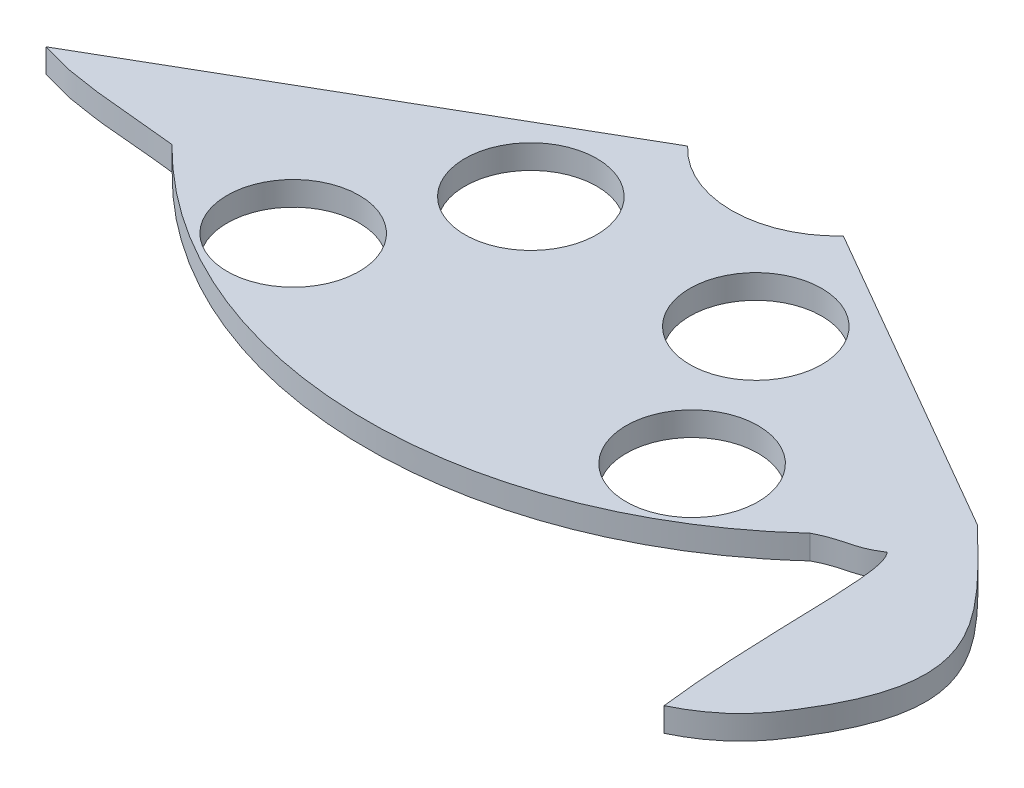
ISO-10303-21;
HEADER;
FILE_DESCRIPTION(('STEP AP214'),'2;1');
FILE_NAME('part.step','',(''),(''),'','','');
FILE_SCHEMA(('AUTOMOTIVE_DESIGN { 1 0 10303 214 1 1 1 1 }'));
ENDSEC;
DATA;
#1=APPLICATION_CONTEXT('core data for automotive mechanical design processes');
#2=APPLICATION_PROTOCOL_DEFINITION('international standard','automotive_design',2000,#1);
#3=PRODUCT_CONTEXT('',#1,'mechanical');
#4=PRODUCT('Part','Part','',(#3));
#5=PRODUCT_RELATED_PRODUCT_CATEGORY('part','',(#4));
#6=PRODUCT_DEFINITION_FORMATION('','',#4);
#7=PRODUCT_DEFINITION_CONTEXT('part definition',#1,'design');
#8=PRODUCT_DEFINITION('design','',#6,#7);
#9=PRODUCT_DEFINITION_SHAPE('','',#8);
#10=(LENGTH_UNIT() NAMED_UNIT(*) SI_UNIT(.MILLI.,.METRE.));
#11=(NAMED_UNIT(*) PLANE_ANGLE_UNIT() SI_UNIT($,.RADIAN.));
#12=(NAMED_UNIT(*) SI_UNIT($,.STERADIAN.) SOLID_ANGLE_UNIT());
#13=UNCERTAINTY_MEASURE_WITH_UNIT(LENGTH_MEASURE(1.E-05),#10,'distance_accuracy_value','');
#14=(GEOMETRIC_REPRESENTATION_CONTEXT(3) GLOBAL_UNCERTAINTY_ASSIGNED_CONTEXT((#13)) GLOBAL_UNIT_ASSIGNED_CONTEXT((#10,
#11,#12)) REPRESENTATION_CONTEXT('',''));
#15=CARTESIAN_POINT('',(0.,0.,0.));
#16=DIRECTION('',(0.,0.,1.));
#17=DIRECTION('',(1.,0.,0.));
#18=AXIS2_PLACEMENT_3D('',#15,#16,#17);
#19=CARTESIAN_POINT('',(-68.5612286542199,-27.7359999999999,53.6734064837464));
#20=DIRECTION('',(0.,-1.,0.));
#21=DIRECTION('',(0.,0.,-1.));
#22=AXIS2_PLACEMENT_3D('',#19,#20,#21);
#23=PLANE('',#22);
#24=CARTESIAN_POINT('',(18.75,-27.7359999999999,32.476));
#25=DIRECTION('',(0.,-1.,0.));
#26=DIRECTION('',(0.,0.,-1.));
#27=AXIS2_PLACEMENT_3D('',#24,#25,#26);
#28=CIRCLE('',#27,10.999845998306);
#29=CARTESIAN_POINT('',(18.75,-27.7359999999999,21.476154001694));
#30=VERTEX_POINT('',#29);
#31=EDGE_CURVE('E320',#30,#30,#28,.T.);
#32=ORIENTED_EDGE('',*,*,#31,.F.);
#33=EDGE_LOOP('',(#32));
#34=FACE_BOUND('',#33,.T.);
#35=CARTESIAN_POINT('',(-33.25,-27.7359999999999,57.591));
#36=DIRECTION('',(0.,-1.,0.));
#37=DIRECTION('',(0.,0.,-1.));
#38=AXIS2_PLACEMENT_3D('',#35,#36,#37);
#39=CIRCLE('',#38,10.999845998306);
#40=CARTESIAN_POINT('',(-33.25,-27.7359999999999,46.591154001694));
#41=VERTEX_POINT('',#40);
#42=EDGE_CURVE('E313',#41,#41,#39,.T.);
#43=ORIENTED_EDGE('',*,*,#42,.F.);
#44=EDGE_LOOP('',(#43));
#45=FACE_BOUND('',#44,.T.);
#46=DIRECTION('',(0.866026689555144,0.,-0.499997772973199));
#47=VECTOR('',#46,1.);
#48=CARTESIAN_POINT('',(-69.4473397155558,-27.7359999999999,44.714296535633));
#49=LINE('',#48,#47);
#50=CARTESIAN_POINT('',(-80.7831862167474,-27.7359999999999,51.2590116970945));
#51=VERTEX_POINT('',#50);
#52=CARTESIAN_POINT('',(-69.4473397155558,-27.7359999999999,44.714296535633));
#53=VERTEX_POINT('',#52);
#54=EDGE_CURVE('E309',#51,#53,#49,.T.);
#55=ORIENTED_EDGE('',*,*,#54,.T.);
#56=DIRECTION('',(0.866025121509883,0.,-0.500000488913553));
#57=VECTOR('',#56,1.);
#58=CARTESIAN_POINT('',(-69.4473397155558,-27.7359999999999,44.714296535633));
#59=LINE('',#58,#57);
#60=CARTESIAN_POINT('',(-12.9766531358799,-27.7359999999999,12.1108879302399));
#61=VERTEX_POINT('',#60);
#62=EDGE_CURVE('E100',#53,#61,#59,.T.);
#63=ORIENTED_EDGE('',*,*,#62,.T.);
#64=CARTESIAN_POINT('',(0.,-27.7359999999999,0.));
#65=DIRECTION('',(0.,1.,0.));
#66=DIRECTION('',(0.,0.,-1.));
#67=AXIS2_PLACEMENT_3D('',#64,#65,#66);
#68=CIRCLE('',#67,17.7501305084715);
#69=CARTESIAN_POINT('',(12.9766531358511,-27.7359999999999,12.1108879302707));
#70=VERTEX_POINT('',#69);
#71=EDGE_CURVE('E306',#61,#70,#68,.T.);
#72=ORIENTED_EDGE('',*,*,#71,.T.);
#73=DIRECTION('',(0.866025113442762,0.,0.500000502886197));
#74=VECTOR('',#73,1.);
#75=CARTESIAN_POINT('',(12.9766531358511,-27.7359999999999,12.1108879302707));
#76=LINE('',#75,#74);
#77=CARTESIAN_POINT('',(65.8946490574716,-27.7359999999999,42.6631480920527));
#78=VERTEX_POINT('',#77);
#79=EDGE_CURVE('E300',#70,#78,#76,.T.);
#80=ORIENTED_EDGE('',*,*,#79,.T.);
#81=CARTESIAN_POINT('',(65.8946490574716,-27.7359999999999,42.6631480920527));
#82=CARTESIAN_POINT('',(81.2383570122726,-27.7359999999999,57.6152141275644));
#83=CARTESIAN_POINT('',(89.9374263412387,-27.7359999999999,65.8113401457254));
#84=CARTESIAN_POINT('',(73.7337723522561,-27.7359999999999,89.9010128395377));
#85=CARTESIAN_POINT('',(70.1752181282031,-27.7359999999999,92.7664869464439));
#86=CARTESIAN_POINT('',(65.8440984830518,-27.7359999999999,94.8522972837208));
#87=B_SPLINE_CURVE_WITH_KNOTS('',3,(#81,#82,#83,#84,#85,#86),.UNSPECIFIED.,.F.,.F.,(4,2,4),(0.,
0.837160428876228,1.),.UNSPECIFIED.);
#88=CARTESIAN_POINT('',(65.8441089277339,-27.7359999999999,94.8522922536968));
#89=VERTEX_POINT('',#88);
#90=EDGE_CURVE('E275',#78,#89,#87,.T.);
#91=ORIENTED_EDGE('',*,*,#90,.T.);
#92=CARTESIAN_POINT('',(62.2755087547801,-27.7359999999999,54.1122355939023));
#93=CARTESIAN_POINT('',(62.3266192430533,-27.7359999999999,54.1699732663106));
#94=CARTESIAN_POINT('',(62.4318143310961,-27.7359999999999,54.2888036366157));
#95=CARTESIAN_POINT('',(62.5724896791839,-27.7359999999999,54.4903283306719));
#96=CARTESIAN_POINT('',(62.7063805668704,-27.7359999999999,54.714128411608));
#97=CARTESIAN_POINT('',(62.8859638163512,-27.7359999999999,55.0685448727052));
#98=CARTESIAN_POINT('',(63.091631452287,-27.7359999999999,55.5915489816227));
#99=CARTESIAN_POINT('',(63.3429327912433,-27.7359999999999,56.4532673372439));
#100=CARTESIAN_POINT('',(63.5785892816123,-27.7359999999999,57.6203475271628));
#101=CARTESIAN_POINT('',(63.7666257012106,-27.7359999999999,58.9899941319844));
#102=CARTESIAN_POINT('',(63.9099365252909,-27.7359999999999,60.4321592671485));
#103=CARTESIAN_POINT('',(64.0494092760135,-27.7359999999999,62.3047583443745));
#104=CARTESIAN_POINT('',(64.1670443203941,-27.7359999999999,64.6753421553893));
#105=CARTESIAN_POINT('',(64.2664191701575,-27.7359999999999,67.4902085799562));
#106=CARTESIAN_POINT('',(64.3487981388482,-27.7359999999999,70.3056992855746));
#107=CARTESIAN_POINT('',(64.4154669468905,-27.7359999999999,72.6520061123916));
#108=CARTESIAN_POINT('',(64.4725617516335,-27.7359999999999,74.5289348020474));
#109=CARTESIAN_POINT('',(64.5335120439495,-27.7359999999999,76.4055798566303));
#110=CARTESIAN_POINT('',(64.6193385087515,-27.7359999999999,78.7507340971859));
#111=CARTESIAN_POINT('',(64.744681422549,-27.7359999999999,81.5635760692582));
#112=CARTESIAN_POINT('',(64.8988491772077,-27.7359999999999,84.374488875223));
#113=CARTESIAN_POINT('',(65.0571517714022,-27.7359999999999,86.719320955091));
#114=CARTESIAN_POINT('',(65.2046396024728,-27.7359999999999,88.5900627981417));
#115=CARTESIAN_POINT('',(65.3217480606023,-27.7359999999999,89.9406461547562));
#116=CARTESIAN_POINT('',(65.4434061411613,-27.7359999999999,91.2279666152676));
#117=CARTESIAN_POINT('',(65.5689149422204,-27.7359999999999,92.4543151066945));
#118=CARTESIAN_POINT('',(65.7011166189491,-27.7359999999999,93.6604679677826));
#119=CARTESIAN_POINT('',(65.7967041598795,-27.7359999999999,94.4571790194458));
#120=CARTESIAN_POINT('',(65.8441089277339,-27.7359999999999,94.8522922536968));
#121=B_SPLINE_CURVE_WITH_KNOTS('',3,(#92,#93,#94,#95,#96,#97,#98,#99,#100,#101,#102,#103,#104,
#105,#106,#107,#108,#109,#110,#111,#112,#113,#114,#115,#116,#117,#118,#119,#120),.UNSPECIFIED.,
.F.,.F.,(4,1,1,1,1,1,1,1,1,1,1,1,1,1,1,1,1,1,1,1,1,1,1,1,1,1,4),(0.,0.005624179748285,
0.0115753611252289,0.0179035407033377,0.0246486044963791,0.0405530712357571,0.0588327547039063,
0.090105924568066,0.127349804255726,0.159702949336848,0.195872267731154,0.264396037182652,
0.332923459385077,0.401452431411221,0.469981458396479,0.504245945192835,0.538509757191767,
0.607026989779701,0.675528345738199,0.744015536301525,0.812495212378262,0.847057398883729,
0.880980500159926,0.911440992680279,0.941434583815239,0.970956628811091,1.00000198258113),.UNSPECIFIED.);
#122=CARTESIAN_POINT('',(62.2755087547809,-27.7359999999999,54.1122355939031));
#123=VERTEX_POINT('',#122);
#124=EDGE_CURVE('E124',#89,#123,#121,.F.);
#125=ORIENTED_EDGE('',*,*,#124,.T.);
#126=CARTESIAN_POINT('',(53.1303911460647,-27.7359999999999,57.7880670822766));
#127=CARTESIAN_POINT('',(53.2175511360422,-27.7359999999999,57.7425732431927));
#128=CARTESIAN_POINT('',(53.3802419413835,-27.7359999999999,57.6576555037513));
#129=CARTESIAN_POINT('',(53.7313534764893,-27.7359999999999,57.4814526272987));
#130=CARTESIAN_POINT('',(54.3754030095421,-27.7359999999999,57.17678713229));
#131=CARTESIAN_POINT('',(55.3453574641,-27.7359999999999,56.7818647359935));
#132=CARTESIAN_POINT('',(56.3445266998864,-27.7359999999999,56.4665023516139));
#133=CARTESIAN_POINT('',(57.1542348944323,-27.7359999999999,56.2459375570913));
#134=CARTESIAN_POINT('',(57.9673984698596,-27.7359999999999,56.0333188869035));
#135=CARTESIAN_POINT('',(58.9808521627782,-27.7359999999999,55.7539073584484));
#136=CARTESIAN_POINT('',(60.1631902995906,-27.7359999999999,55.3155825721633));
#137=CARTESIAN_POINT('',(61.10190433462,-27.7359999999999,54.8453456793138));
#138=CARTESIAN_POINT('',(61.7145277152935,-27.7359999999999,54.4792748342456));
#139=CARTESIAN_POINT('',(62.0442812080695,-27.7359999999999,54.2678803883244));
#140=CARTESIAN_POINT('',(62.1955897374735,-27.7359999999999,54.1660319618706));
#141=CARTESIAN_POINT('',(62.2755087547998,-27.7359999999999,54.1122355939311));
#142=B_SPLINE_CURVE_WITH_KNOTS('',3,(#126,#127,#128,#129,#130,#131,#132,#133,#134,#135,#136,
#137,#138,#139,#140,#141),.UNSPECIFIED.,.F.,.F.,(4,1,1,1,1,1,1,1,1,1,1,1,1,4),
(3.13887367888732E-05,0.0298210337786223,0.0556360456893082,0.119056708604838,0.245666039974793,
0.372585778940183,0.436254340542962,0.499940026632528,0.627267780931677,0.754633424607713,
0.881327250136131,0.944737214077149,0.970810734794514,1.),.UNSPECIFIED.);
#143=CARTESIAN_POINT('',(53.1303911460647,-27.7359999999999,57.7880670822766));
#144=VERTEX_POINT('',#143);
#145=EDGE_CURVE('E116',#123,#144,#142,.F.);
#146=ORIENTED_EDGE('',*,*,#145,.T.);
#147=CARTESIAN_POINT('',(-56.1394269279716,-27.7359999999999,54.8686797639619));
#148=CARTESIAN_POINT('',(-52.6175262939561,-27.7359999999999,58.4719983855394));
#149=CARTESIAN_POINT('',(-48.7495089803754,-27.7359999999999,61.734414001229));
#150=CARTESIAN_POINT('',(-40.4573380755175,-27.7359999999999,67.459771709233));
#151=CARTESIAN_POINT('',(-36.0368957741686,-27.7359999999999,69.9211550084487));
#152=CARTESIAN_POINT('',(-26.8006681495254,-27.7359999999999,73.9547771532518));
#153=CARTESIAN_POINT('',(-21.9911364494542,-27.7359999999999,75.5248933212206));
#154=CARTESIAN_POINT('',(-12.1554449538981,-27.7359999999999,77.7161119983587));
#155=CARTESIAN_POINT('',(-7.13313413181398,-27.7359999999999,78.3366809738792));
#156=CARTESIAN_POINT('',(2.94030854550655,-27.7359999999999,78.6059226656511));
#157=CARTESIAN_POINT('',(7.98798639155581,-27.7359999999999,78.2545169171155));
#158=CARTESIAN_POINT('',(17.927233656144,-27.7359999999999,76.591215401033));
#159=CARTESIAN_POINT('',(22.8153250828588,-27.7359999999999,75.2801017515853));
#160=CARTESIAN_POINT('',(29.8924842178698,-27.7359999999999,72.6301504100697));
#161=CARTESIAN_POINT('',(32.2081330428238,-27.7359999999999,71.6335743394989));
#162=CARTESIAN_POINT('',(36.7329814206638,-27.7359999999999,69.4205726698404));
#163=CARTESIAN_POINT('',(38.9447771615099,-27.7359999999999,68.2039453667551));
#164=CARTESIAN_POINT('',(43.2377987573878,-27.7359999999999,65.5678639786725));
#165=CARTESIAN_POINT('',(45.31845866695,-27.7359999999999,64.1465934111431));
#166=CARTESIAN_POINT('',(49.338895948512,-27.7359999999999,61.1075407378893));
#167=CARTESIAN_POINT('',(51.2760119182162,-27.7359999999999,59.4925286132339));
#168=CARTESIAN_POINT('',(53.1303911459953,-27.7359999999999,57.7880670822043));
#169=B_SPLINE_CURVE_WITH_KNOTS('',3,(#147,#148,#149,#150,#151,#152,#153,#154,#155,#156,#157,
#158,#159,#160,#161,#162,#163,#164,#165,#166,#167,#168),.UNSPECIFIED.,.F.,.F.,(4,2,2,2,2,2,2,2,
2,2,4),(1.59766757579227E-06,0.125001597667576,0.250001597667576,0.375001597667576,
0.500001597667576,0.625001597667576,0.750001597667576,0.812501597667576,0.875001597667576,
0.937501597667576,1.),.UNSPECIFIED.);
#170=CARTESIAN_POINT('',(-56.1394215171995,-27.7359999999999,54.8686852998177));
#171=VERTEX_POINT('',#170);
#172=EDGE_CURVE('E121',#144,#171,#169,.F.);
#173=ORIENTED_EDGE('',*,*,#172,.T.);
#174=CARTESIAN_POINT('',(-80.7831862167474,-27.7359999999999,51.2590116970945));
#175=CARTESIAN_POINT('',(-80.5676202729123,-27.7359999999999,51.3193692995179));
#176=CARTESIAN_POINT('',(-80.1131419645365,-27.7359999999999,51.4466214088214));
#177=CARTESIAN_POINT('',(-79.1883092136066,-27.7359999999999,51.6953137724993));
#178=CARTESIAN_POINT('',(-78.2436289560257,-27.7359999999999,51.947894472291));
#179=CARTESIAN_POINT('',(-77.3644277209338,-27.7359999999999,52.191213935083));
#180=CARTESIAN_POINT('',(-76.7776019953257,-27.7359999999999,52.3534336079758));
#181=CARTESIAN_POINT('',(-76.2492315571204,-27.7359999999999,52.4942351618834));
#182=CARTESIAN_POINT('',(-75.7176048680058,-27.7359999999999,52.6195954339904));
#183=CARTESIAN_POINT('',(-75.0029615831157,-27.7359999999999,52.755862283146));
#184=CARTESIAN_POINT('',(-74.2835815760933,-27.7359999999999,52.8629408815057));
#185=CARTESIAN_POINT('',(-73.5643017073792,-27.7359999999999,52.9701379164602));
#186=CARTESIAN_POINT('',(-72.845147040621,-27.7359999999999,53.0786227854565));
#187=CARTESIAN_POINT('',(-71.9467724990994,-27.7359999999999,53.2180176106988));
#188=CARTESIAN_POINT('',(-70.8676379980781,-27.7359999999999,53.3792247683198));
#189=CARTESIAN_POINT('',(-69.7865832893868,-27.7359999999999,53.5308869494648));
#190=CARTESIAN_POINT('',(-68.3395492062531,-27.7359999999999,53.7046945564114));
#191=CARTESIAN_POINT('',(-66.5235908548103,-27.7359999999999,53.8740644441505));
#192=CARTESIAN_POINT('',(-64.3416341099557,-27.7359999999999,54.0574969512495));
#193=CARTESIAN_POINT('',(-62.4457109360316,-27.7359999999999,54.2222532209369));
#194=CARTESIAN_POINT('',(-60.9914863976133,-27.7359999999999,54.3553678793915));
#195=CARTESIAN_POINT('',(-59.8036278568244,-27.7359999999999,54.4689563046801));
#196=CARTESIAN_POINT('',(-58.630996557288,-27.7359999999999,54.5877045239225));
#197=CARTESIAN_POINT('',(-57.3511470987932,-27.7359999999999,54.7257174312714));
#198=CARTESIAN_POINT('',(-56.5327078798453,-27.7359999999999,54.8222826263966));
#199=CARTESIAN_POINT('',(-56.1394215245136,-27.7359999999999,54.8686853069665));
#200=B_SPLINE_CURVE_WITH_KNOTS('',3,(#174,#175,#176,#177,#178,#179,#180,#181,#182,#183,#184,
#185,#186,#187,#188,#189,#190,#191,#192,#193,#194,#195,#196,#197,#198,#199),.UNSPECIFIED.,.F.,
.F.,(4,1,1,1,1,1,1,1,1,1,1,1,1,1,1,1,1,1,1,1,1,1,1,4),(0.,0.0269062306652873,0.0567264846198827,
0.115108058466812,0.14443986855033,0.166373697757315,0.188287091937588,0.210160764247867,
0.232008012844454,0.275709179270462,0.297564638949053,0.319419024805695,0.363125199659079,
0.406836751230029,0.450564235718374,0.494330135704901,0.581999843175868,0.669758238840782,
0.757520448460264,0.810736995599169,0.845279072649915,0.900945917782353,0.952401329171181,1.),.UNSPECIFIED.);
#201=EDGE_CURVE('E51',#171,#51,#200,.F.);
#202=ORIENTED_EDGE('',*,*,#201,.T.);
#203=EDGE_LOOP('',(#55,#63,#72,#80,#91,#125,#146,#173,#202));
#204=FACE_BOUND('',#203,.T.);
#205=CARTESIAN_POINT('',(33.25,-27.7359999999999,57.591));
#206=DIRECTION('',(0.,-1.,0.));
#207=DIRECTION('',(0.,0.,-1.));
#208=AXIS2_PLACEMENT_3D('',#205,#206,#207);
#209=CIRCLE('',#208,10.999845998306);
#210=CARTESIAN_POINT('',(33.25,-27.7359999999999,46.591154001694));
#211=VERTEX_POINT('',#210);
#212=EDGE_CURVE('E314',#211,#211,#209,.T.);
#213=ORIENTED_EDGE('',*,*,#212,.F.);
#214=EDGE_LOOP('',(#213));
#215=FACE_BOUND('',#214,.T.);
#216=CARTESIAN_POINT('',(-18.75,-27.7359999999999,32.476));
#217=DIRECTION('',(0.,-1.,0.));
#218=DIRECTION('',(0.,0.,-1.));
#219=AXIS2_PLACEMENT_3D('',#216,#217,#218);
#220=CIRCLE('',#219,10.999845998306);
#221=CARTESIAN_POINT('',(-18.75,-27.7359999999999,21.476154001694));
#222=VERTEX_POINT('',#221);
#223=EDGE_CURVE('E326',#222,#222,#220,.T.);
#224=ORIENTED_EDGE('',*,*,#223,.F.);
#225=EDGE_LOOP('',(#224));
#226=FACE_BOUND('',#225,.T.);
#227=ADVANCED_FACE('F30',(#34,#45,#204,#215,#226),#23,.T.);
#228=CARTESIAN_POINT('',(-68.5612286542199,-23.7359999999999,53.6734064837464));
#229=DIRECTION('',(0.,-1.,0.));
#230=DIRECTION('',(0.,0.,-1.));
#231=AXIS2_PLACEMENT_3D('',#228,#229,#230);
#232=PLANE('',#231);
#233=CARTESIAN_POINT('',(18.75,-23.7359999999999,32.476));
#234=DIRECTION('',(0.,-1.,0.));
#235=DIRECTION('',(0.,0.,-1.));
#236=AXIS2_PLACEMENT_3D('',#233,#234,#235);
#237=CIRCLE('',#236,10.999845998306);
#238=CARTESIAN_POINT('',(18.75,-23.7359999999999,21.476154001694));
#239=VERTEX_POINT('',#238);
#240=EDGE_CURVE('E323',#239,#239,#237,.T.);
#241=ORIENTED_EDGE('',*,*,#240,.T.);
#242=EDGE_LOOP('',(#241));
#243=FACE_BOUND('',#242,.T.);
#244=CARTESIAN_POINT('',(-33.25,-23.7359999999999,57.591));
#245=DIRECTION('',(0.,-1.,0.));
#246=DIRECTION('',(0.,0.,-1.));
#247=AXIS2_PLACEMENT_3D('',#244,#245,#246);
#248=CIRCLE('',#247,10.999845998306);
#249=CARTESIAN_POINT('',(-33.25,-23.7359999999999,46.591154001694));
#250=VERTEX_POINT('',#249);
#251=EDGE_CURVE('E310',#250,#250,#248,.T.);
#252=ORIENTED_EDGE('',*,*,#251,.T.);
#253=EDGE_LOOP('',(#252));
#254=FACE_BOUND('',#253,.T.);
#255=DIRECTION('',(0.866026689555144,0.,-0.499997772973199));
#256=VECTOR('',#255,1.);
#257=CARTESIAN_POINT('',(-69.4473397155558,-23.7359999999999,44.714296535633));
#258=LINE('',#257,#256);
#259=CARTESIAN_POINT('',(-80.7831862167474,-23.7359999999999,51.2590116970945));
#260=VERTEX_POINT('',#259);
#261=CARTESIAN_POINT('',(-69.4473397155558,-23.7359999999999,44.714296535633));
#262=VERTEX_POINT('',#261);
#263=EDGE_CURVE('E189',#260,#262,#258,.T.);
#264=ORIENTED_EDGE('',*,*,#263,.F.);
#265=CARTESIAN_POINT('',(-56.1394215245136,-23.7359999999999,54.8686853069665));
#266=CARTESIAN_POINT('',(-56.5327078798453,-23.7359999999999,54.8222826263966));
#267=CARTESIAN_POINT('',(-57.3511470987932,-23.7359999999999,54.7257174312714));
#268=CARTESIAN_POINT('',(-58.630996557288,-23.7359999999999,54.5877045239225));
#269=CARTESIAN_POINT('',(-59.8036278568244,-23.7359999999999,54.4689563046801));
#270=CARTESIAN_POINT('',(-60.9914863976133,-23.7359999999999,54.3553678793915));
#271=CARTESIAN_POINT('',(-62.4457109360316,-23.7359999999999,54.2222532209369));
#272=CARTESIAN_POINT('',(-64.3416341099557,-23.7359999999999,54.0574969512495));
#273=CARTESIAN_POINT('',(-66.5235908548103,-23.7359999999999,53.8740644441505));
#274=CARTESIAN_POINT('',(-68.3395492062531,-23.7359999999999,53.7046945564114));
#275=CARTESIAN_POINT('',(-69.7865832893868,-23.7359999999999,53.5308869494648));
#276=CARTESIAN_POINT('',(-70.8676379980781,-23.7359999999999,53.3792247683198));
#277=CARTESIAN_POINT('',(-71.9467724990994,-23.7359999999999,53.2180176106988));
#278=CARTESIAN_POINT('',(-72.845147040621,-23.7359999999999,53.0786227854565));
#279=CARTESIAN_POINT('',(-73.5643017073792,-23.7359999999999,52.9701379164602));
#280=CARTESIAN_POINT('',(-74.2835815760933,-23.7359999999999,52.8629408815057));
#281=CARTESIAN_POINT('',(-75.0029615831157,-23.7359999999999,52.755862283146));
#282=CARTESIAN_POINT('',(-75.7176048680058,-23.7359999999999,52.6195954339904));
#283=CARTESIAN_POINT('',(-76.2492315571204,-23.7359999999999,52.4942351618834));
#284=CARTESIAN_POINT('',(-76.7776019953257,-23.7359999999999,52.3534336079758));
#285=CARTESIAN_POINT('',(-77.3644277209338,-23.7359999999999,52.191213935083));
#286=CARTESIAN_POINT('',(-78.2436289560257,-23.7359999999999,51.947894472291));
#287=CARTESIAN_POINT('',(-79.1883092136066,-23.7359999999999,51.6953137724993));
#288=CARTESIAN_POINT('',(-80.1131419645365,-23.7359999999999,51.4466214088214));
#289=CARTESIAN_POINT('',(-80.5676202729123,-23.7359999999999,51.3193692995179));
#290=CARTESIAN_POINT('',(-80.7831862167474,-23.7359999999999,51.2590116970945));
#291=B_SPLINE_CURVE_WITH_KNOTS('',3,(#265,#266,#267,#268,#269,#270,#271,#272,#273,#274,#275,
#276,#277,#278,#279,#280,#281,#282,#283,#284,#285,#286,#287,#288,#289,#290),.UNSPECIFIED.,.F.,
.F.,(4,1,1,1,1,1,1,1,1,1,1,1,1,1,1,1,1,1,1,1,1,1,1,4),(0.,0.0475986708288189,0.0990540822176467,
0.154720927350085,0.189263004400831,0.242479551539736,0.330241761159218,0.418000156824132,
0.505669864295099,0.549435764281626,0.593163248769971,0.636874800340921,0.680580975194305,
0.702435361050947,0.724290820729538,0.767991987155546,0.789839235752133,0.811712908062412,
0.833626302242685,0.85556013144967,0.884891941533188,0.943273515380117,0.973093769334713,1.),.UNSPECIFIED.);
#292=CARTESIAN_POINT('',(-56.1394215171995,-23.7359999999999,54.8686852998177));
#293=VERTEX_POINT('',#292);
#294=EDGE_CURVE('E91',#293,#260,#291,.T.);
#295=ORIENTED_EDGE('',*,*,#294,.F.);
#296=CARTESIAN_POINT('',(53.1303911459953,-23.7359999999999,57.7880670822043));
#297=CARTESIAN_POINT('',(51.2760119182162,-23.7359999999999,59.4925286132339));
#298=CARTESIAN_POINT('',(49.338895948512,-23.7359999999999,61.1075407378893));
#299=CARTESIAN_POINT('',(45.31845866695,-23.7359999999999,64.1465934111431));
#300=CARTESIAN_POINT('',(43.2377987573878,-23.7359999999999,65.5678639786725));
#301=CARTESIAN_POINT('',(38.9447771615099,-23.7359999999999,68.2039453667551));
#302=CARTESIAN_POINT('',(36.7329814206638,-23.7359999999999,69.4205726698404));
#303=CARTESIAN_POINT('',(32.2081330428238,-23.7359999999999,71.6335743394989));
#304=CARTESIAN_POINT('',(29.8924842178698,-23.7359999999999,72.6301504100697));
#305=CARTESIAN_POINT('',(22.8153250828588,-23.7359999999999,75.2801017515853));
#306=CARTESIAN_POINT('',(17.927233656144,-23.7359999999999,76.591215401033));
#307=CARTESIAN_POINT('',(7.98798639155581,-23.7359999999999,78.2545169171155));
#308=CARTESIAN_POINT('',(2.94030854550655,-23.7359999999999,78.6059226656511));
#309=CARTESIAN_POINT('',(-7.13313413181398,-23.7359999999999,78.3366809738792));
#310=CARTESIAN_POINT('',(-12.1554449538981,-23.7359999999999,77.7161119983587));
#311=CARTESIAN_POINT('',(-21.9911364494542,-23.7359999999999,75.5248933212206));
#312=CARTESIAN_POINT('',(-26.8006681495254,-23.7359999999999,73.9547771532518));
#313=CARTESIAN_POINT('',(-36.0368957741686,-23.7359999999999,69.9211550084487));
#314=CARTESIAN_POINT('',(-40.4573380755175,-23.7359999999999,67.459771709233));
#315=CARTESIAN_POINT('',(-48.7495089803754,-23.7359999999999,61.734414001229));
#316=CARTESIAN_POINT('',(-52.6175262939561,-23.7359999999999,58.4719983855394));
#317=CARTESIAN_POINT('',(-56.1394269279716,-23.7359999999999,54.8686797639619));
#318=B_SPLINE_CURVE_WITH_KNOTS('',3,(#296,#297,#298,#299,#300,#301,#302,#303,#304,#305,#306,
#307,#308,#309,#310,#311,#312,#313,#314,#315,#316,#317),.UNSPECIFIED.,.F.,.F.,(4,2,2,2,2,2,2,2,
2,2,4),(1.59766757579144E-06,0.0624999999999999,0.125,0.1875,0.25,0.375,0.5,0.625,0.75,0.875,
1.),.UNSPECIFIED.);
#319=CARTESIAN_POINT('',(53.1303911460647,-23.7359999999999,57.7880670822766));
#320=VERTEX_POINT('',#319);
#321=EDGE_CURVE('E84',#320,#293,#318,.T.);
#322=ORIENTED_EDGE('',*,*,#321,.F.);
#323=CARTESIAN_POINT('',(62.2755087547998,-23.7359999999999,54.1122355939311));
#324=CARTESIAN_POINT('',(62.1955897374735,-23.7359999999999,54.1660319618706));
#325=CARTESIAN_POINT('',(62.0442812080695,-23.7359999999999,54.2678803883244));
#326=CARTESIAN_POINT('',(61.7145277152935,-23.7359999999999,54.4792748342456));
#327=CARTESIAN_POINT('',(61.10190433462,-23.7359999999999,54.8453456793138));
#328=CARTESIAN_POINT('',(60.1631902995906,-23.7359999999999,55.3155825721633));
#329=CARTESIAN_POINT('',(58.9808521627782,-23.7359999999999,55.7539073584484));
#330=CARTESIAN_POINT('',(57.9673984698596,-23.7359999999999,56.0333188869035));
#331=CARTESIAN_POINT('',(57.1542348944323,-23.7359999999999,56.2459375570913));
#332=CARTESIAN_POINT('',(56.3445266998864,-23.7359999999999,56.4665023516139));
#333=CARTESIAN_POINT('',(55.3453574641,-23.7359999999999,56.7818647359935));
#334=CARTESIAN_POINT('',(54.3754030095421,-23.7359999999999,57.17678713229));
#335=CARTESIAN_POINT('',(53.7313534764893,-23.7359999999999,57.4814526272987));
#336=CARTESIAN_POINT('',(53.3802419413835,-23.7359999999999,57.6576555037513));
#337=CARTESIAN_POINT('',(53.2175511360422,-23.7359999999999,57.7425732431927));
#338=CARTESIAN_POINT('',(53.1303911460647,-23.7359999999999,57.7880670822766));
#339=B_SPLINE_CURVE_WITH_KNOTS('',3,(#323,#324,#325,#326,#327,#328,#329,#330,#331,#332,#333,
#334,#335,#336,#337,#338),.UNSPECIFIED.,.F.,.F.,(4,1,1,1,1,1,1,1,1,1,1,1,1,4),
(3.13887367888217E-05,0.0292206539422754,0.0552941746596395,0.118704138600658,0.245397964129075,
0.372763607805111,0.500091362104261,0.563777048193827,0.627445609796606,0.754365348761996,
0.880974680131951,0.944395343047481,0.970210354958167,1.),.UNSPECIFIED.);
#340=CARTESIAN_POINT('',(62.2755087547809,-23.7359999999999,54.1122355939031));
#341=VERTEX_POINT('',#340);
#342=EDGE_CURVE('E135',#341,#320,#339,.T.);
#343=ORIENTED_EDGE('',*,*,#342,.F.);
#344=CARTESIAN_POINT('',(65.8441089277339,-23.7359999999999,94.8522922536968));
#345=CARTESIAN_POINT('',(65.7967041598795,-23.7359999999999,94.4571790194458));
#346=CARTESIAN_POINT('',(65.7011166189491,-23.7359999999999,93.6604679677826));
#347=CARTESIAN_POINT('',(65.5689149422204,-23.7359999999999,92.4543151066945));
#348=CARTESIAN_POINT('',(65.4434061411613,-23.7359999999999,91.2279666152676));
#349=CARTESIAN_POINT('',(65.3217480606023,-23.7359999999999,89.9406461547562));
#350=CARTESIAN_POINT('',(65.2046396024728,-23.7359999999999,88.5900627981417));
#351=CARTESIAN_POINT('',(65.0571517714022,-23.7359999999999,86.719320955091));
#352=CARTESIAN_POINT('',(64.8988491772077,-23.7359999999999,84.374488875223));
#353=CARTESIAN_POINT('',(64.744681422549,-23.7359999999999,81.5635760692582));
#354=CARTESIAN_POINT('',(64.6193385087515,-23.7359999999999,78.7507340971859));
#355=CARTESIAN_POINT('',(64.5335120439495,-23.7359999999999,76.4055798566303));
#356=CARTESIAN_POINT('',(64.4725617516335,-23.7359999999999,74.5289348020474));
#357=CARTESIAN_POINT('',(64.4154669468905,-23.7359999999999,72.6520061123916));
#358=CARTESIAN_POINT('',(64.3487981388482,-23.7359999999999,70.3056992855746));
#359=CARTESIAN_POINT('',(64.2664191701575,-23.7359999999999,67.4902085799562));
#360=CARTESIAN_POINT('',(64.1670443203941,-23.7359999999999,64.6753421553893));
#361=CARTESIAN_POINT('',(64.0494092760135,-23.7359999999999,62.3047583443745));
#362=CARTESIAN_POINT('',(63.9099365252909,-23.7359999999999,60.4321592671485));
#363=CARTESIAN_POINT('',(63.7666257012106,-23.7359999999999,58.9899941319844));
#364=CARTESIAN_POINT('',(63.5785892816123,-23.7359999999999,57.6203475271628));
#365=CARTESIAN_POINT('',(63.3429327912433,-23.7359999999999,56.4532673372439));
#366=CARTESIAN_POINT('',(63.091631452287,-23.7359999999999,55.5915489816227));
#367=CARTESIAN_POINT('',(62.8859638163512,-23.7359999999999,55.0685448727052));
#368=CARTESIAN_POINT('',(62.7063805668704,-23.7359999999999,54.714128411608));
#369=CARTESIAN_POINT('',(62.5724896791839,-23.7359999999999,54.4903283306719));
#370=CARTESIAN_POINT('',(62.4318143310961,-23.7359999999999,54.2888036366157));
#371=CARTESIAN_POINT('',(62.3266192430533,-23.7359999999999,54.1699732663106));
#372=CARTESIAN_POINT('',(62.2755087547801,-23.7359999999999,54.1122355939023));
#373=B_SPLINE_CURVE_WITH_KNOTS('',3,(#344,#345,#346,#347,#348,#349,#350,#351,#352,#353,#354,
#355,#356,#357,#358,#359,#360,#361,#362,#363,#364,#365,#366,#367,#368,#369,#370,#371,#372),
.UNSPECIFIED.,.F.,.F.,(4,1,1,1,1,1,1,1,1,1,1,1,1,1,1,1,1,1,1,1,1,1,1,1,1,1,4),(0.,
0.0290453537700364,0.0585673987658884,0.0885609899008483,0.119021482421202,0.152944583697398,
0.187506770202865,0.255986446279603,0.324473636842928,0.392974992801427,0.46149222538936,
0.495756037388292,0.530020524184648,0.598549551169907,0.66707852319605,0.735605945398475,
0.804129714849973,0.840299033244279,0.872652178325401,0.909896058013061,0.941169227877221,
0.95944891134537,0.975353378084748,0.98209844187779,0.988426621455898,0.994377802832842,
1.00000198258113),.UNSPECIFIED.);
#374=CARTESIAN_POINT('',(65.8441089277339,-23.7359999999999,94.8522922536968));
#375=VERTEX_POINT('',#374);
#376=EDGE_CURVE('E519',#375,#341,#373,.T.);
#377=ORIENTED_EDGE('',*,*,#376,.F.);
#378=CARTESIAN_POINT('',(65.8946490574716,-23.7359999999999,42.6631480920527));
#379=CARTESIAN_POINT('',(81.2383570122726,-23.7359999999999,57.6152141275644));
#380=CARTESIAN_POINT('',(89.9374263412387,-23.7359999999999,65.8113401457254));
#381=CARTESIAN_POINT('',(73.7337723522561,-23.7359999999999,89.9010128395377));
#382=CARTESIAN_POINT('',(70.1752181282031,-23.7359999999999,92.7664869464439));
#383=CARTESIAN_POINT('',(65.8440984830518,-23.7359999999999,94.8522972837208));
#384=B_SPLINE_CURVE_WITH_KNOTS('',3,(#378,#379,#380,#381,#382,#383),.UNSPECIFIED.,.F.,.F.,(4,2,
4),(0.,0.837160428876228,1.),.UNSPECIFIED.);
#385=CARTESIAN_POINT('',(65.8946490574716,-23.7359999999999,42.6631480920527));
#386=VERTEX_POINT('',#385);
#387=EDGE_CURVE('E193',#386,#375,#384,.T.);
#388=ORIENTED_EDGE('',*,*,#387,.F.);
#389=DIRECTION('',(0.866025113442762,0.,0.500000502886197));
#390=VECTOR('',#389,1.);
#391=CARTESIAN_POINT('',(12.9766531358511,-23.7359999999999,12.1108879302707));
#392=LINE('',#391,#390);
#393=CARTESIAN_POINT('',(12.9766531358511,-23.7359999999999,12.1108879302707));
#394=VERTEX_POINT('',#393);
#395=EDGE_CURVE('E191',#394,#386,#392,.T.);
#396=ORIENTED_EDGE('',*,*,#395,.F.);
#397=CARTESIAN_POINT('',(0.,-23.7359999999999,0.));
#398=DIRECTION('',(0.,1.,0.));
#399=DIRECTION('',(0.,0.,-1.));
#400=AXIS2_PLACEMENT_3D('',#397,#398,#399);
#401=CIRCLE('',#400,17.7501305084715);
#402=CARTESIAN_POINT('',(-12.9766531358799,-23.7359999999999,12.1108879302399));
#403=VERTEX_POINT('',#402);
#404=EDGE_CURVE('E188',#403,#394,#401,.T.);
#405=ORIENTED_EDGE('',*,*,#404,.F.);
#406=DIRECTION('',(0.866025121509883,0.,-0.500000488913553));
#407=VECTOR('',#406,1.);
#408=CARTESIAN_POINT('',(-69.4473397155558,-23.7359999999999,44.714296535633));
#409=LINE('',#408,#407);
#410=EDGE_CURVE('E183',#262,#403,#409,.T.);
#411=ORIENTED_EDGE('',*,*,#410,.F.);
#412=EDGE_LOOP('',(#264,#295,#322,#343,#377,#388,#396,#405,#411));
#413=FACE_BOUND('',#412,.T.);
#414=CARTESIAN_POINT('',(33.25,-23.7359999999999,57.591));
#415=DIRECTION('',(0.,-1.,0.));
#416=DIRECTION('',(0.,0.,-1.));
#417=AXIS2_PLACEMENT_3D('',#414,#415,#416);
#418=CIRCLE('',#417,10.999845998306);
#419=CARTESIAN_POINT('',(33.25,-23.7359999999999,46.591154001694));
#420=VERTEX_POINT('',#419);
#421=EDGE_CURVE('E317',#420,#420,#418,.T.);
#422=ORIENTED_EDGE('',*,*,#421,.T.);
#423=EDGE_LOOP('',(#422));
#424=FACE_BOUND('',#423,.T.);
#425=CARTESIAN_POINT('',(-18.75,-23.7359999999999,32.476));
#426=DIRECTION('',(0.,-1.,0.));
#427=DIRECTION('',(0.,0.,-1.));
#428=AXIS2_PLACEMENT_3D('',#425,#426,#427);
#429=CIRCLE('',#428,10.999845998306);
#430=CARTESIAN_POINT('',(-18.75,-23.7359999999999,21.476154001694));
#431=VERTEX_POINT('',#430);
#432=EDGE_CURVE('E329',#431,#431,#429,.T.);
#433=ORIENTED_EDGE('',*,*,#432,.T.);
#434=EDGE_LOOP('',(#433));
#435=FACE_BOUND('',#434,.T.);
#436=ADVANCED_FACE('F215',(#243,#254,#413,#424,#435),#232,.F.);
#437=CARTESIAN_POINT('',(-69.4473397155558,-27.7359999999999,44.714296535633));
#438=DIRECTION('',(0.499997772973199,0.,0.866026689555144));
#439=DIRECTION('',(0.866026689555144,0.,-0.499997772973199));
#440=AXIS2_PLACEMENT_3D('',#437,#438,#439);
#441=PLANE('',#440);
#442=ORIENTED_EDGE('',*,*,#263,.T.);
#443=DIRECTION('',(0.,1.,0.));
#444=VECTOR('',#443,1.);
#445=CARTESIAN_POINT('',(-69.4473397155558,-27.7359999999999,44.714296535633));
#446=LINE('',#445,#444);
#447=EDGE_CURVE('E11',#53,#262,#446,.T.);
#448=ORIENTED_EDGE('',*,*,#447,.F.);
#449=ORIENTED_EDGE('',*,*,#54,.F.);
#450=DIRECTION('',(0.,1.,0.));
#451=VECTOR('',#450,1.);
#452=CARTESIAN_POINT('',(-80.7831862167474,-27.7359999999999,51.2590116970945));
#453=LINE('',#452,#451);
#454=EDGE_CURVE('E482',#51,#260,#453,.T.);
#455=ORIENTED_EDGE('',*,*,#454,.T.);
#456=EDGE_LOOP('',(#442,#448,#449,#455));
#457=FACE_BOUND('',#456,.T.);
#458=ADVANCED_FACE('F32',(#457),#441,.F.);
#459=CARTESIAN_POINT('',(-69.4473397155558,-27.7359999999999,44.714296535633));
#460=DIRECTION('',(0.500000488913553,0.,0.866025121509883));
#461=DIRECTION('',(0.866025121509883,0.,-0.500000488913553));
#462=AXIS2_PLACEMENT_3D('',#459,#460,#461);
#463=PLANE('',#462);
#464=ORIENTED_EDGE('',*,*,#410,.T.);
#465=DIRECTION('',(0.,1.,0.));
#466=VECTOR('',#465,1.);
#467=CARTESIAN_POINT('',(-12.9766531358799,-27.7359999999999,12.1108879302399));
#468=LINE('',#467,#466);
#469=EDGE_CURVE('E42',#61,#403,#468,.T.);
#470=ORIENTED_EDGE('',*,*,#469,.F.);
#471=ORIENTED_EDGE('',*,*,#62,.F.);
#472=ORIENTED_EDGE('',*,*,#447,.T.);
#473=EDGE_LOOP('',(#464,#470,#471,#472));
#474=FACE_BOUND('',#473,.T.);
#475=ADVANCED_FACE('F348',(#474),#463,.F.);
#476=CARTESIAN_POINT('',(0.,-27.7359999999999,0.));
#477=DIRECTION('',(0.,1.,0.));
#478=DIRECTION('',(0.,0.,1.));
#479=AXIS2_PLACEMENT_3D('',#476,#477,#478);
#480=CYLINDRICAL_SURFACE('',#479,17.7501305084715);
#481=ORIENTED_EDGE('',*,*,#404,.T.);
#482=DIRECTION('',(0.,1.,0.));
#483=VECTOR('',#482,1.);
#484=CARTESIAN_POINT('',(12.9766531358511,-27.7359999999999,12.1108879302707));
#485=LINE('',#484,#483);
#486=EDGE_CURVE('E197',#70,#394,#485,.T.);
#487=ORIENTED_EDGE('',*,*,#486,.F.);
#488=ORIENTED_EDGE('',*,*,#71,.F.);
#489=ORIENTED_EDGE('',*,*,#469,.T.);
#490=EDGE_LOOP('',(#481,#487,#488,#489));
#491=FACE_BOUND('',#490,.T.);
#492=ADVANCED_FACE('F408',(#491),#480,.F.);
#493=CARTESIAN_POINT('',(12.9766531358511,-27.7359999999999,12.1108879302707));
#494=DIRECTION('',(-0.500000502886198,0.,0.866025113442763));
#495=DIRECTION('',(0.866025113442762,0.,0.500000502886197));
#496=AXIS2_PLACEMENT_3D('',#493,#494,#495);
#497=PLANE('',#496);
#498=ORIENTED_EDGE('',*,*,#395,.T.);
#499=DIRECTION('',(0.,1.,0.));
#500=VECTOR('',#499,1.);
#501=CARTESIAN_POINT('',(65.8946490574716,-27.7359999999999,42.6631480920527));
#502=LINE('',#501,#500);
#503=EDGE_CURVE('E194',#78,#386,#502,.T.);
#504=ORIENTED_EDGE('',*,*,#503,.F.);
#505=ORIENTED_EDGE('',*,*,#79,.F.);
#506=ORIENTED_EDGE('',*,*,#486,.T.);
#507=EDGE_LOOP('',(#498,#504,#505,#506));
#508=FACE_BOUND('',#507,.T.);
#509=ADVANCED_FACE('F400',(#508),#497,.F.);
#510=DIRECTION('',(0.,1.,0.));
#511=VECTOR('',#510,1.);
#512=SURFACE_OF_LINEAR_EXTRUSION('',#87,#511);
#513=ORIENTED_EDGE('',*,*,#387,.T.);
#514=DIRECTION('',(0.,1.,0.));
#515=VECTOR('',#514,1.);
#516=CARTESIAN_POINT('',(65.8441089277339,-27.7359999999999,94.8522922536968));
#517=LINE('',#516,#515);
#518=EDGE_CURVE('E198',#89,#375,#517,.T.);
#519=ORIENTED_EDGE('',*,*,#518,.F.);
#520=ORIENTED_EDGE('',*,*,#90,.F.);
#521=ORIENTED_EDGE('',*,*,#503,.T.);
#522=EDGE_LOOP('',(#513,#519,#520,#521));
#523=FACE_BOUND('',#522,.T.);
#524=ADVANCED_FACE('F287',(#523),#512,.F.);
#525=CARTESIAN_POINT('',(-4877.1841040268,-27.7359999999999,830.022980984099));
#526=CARTESIAN_POINT('',(115.31363587458,-27.7359999999999,197.064256340167));
#527=CARTESIAN_POINT('',(71.5642288141988,-27.7359999999999,147.153053872677));
#528=CARTESIAN_POINT('',(65.5689149422204,-27.7359999999999,92.4543151066945));
#529=CARTESIAN_POINT('',(65.4434061411613,-27.7359999999999,91.2279666152676));
#530=CARTESIAN_POINT('',(65.3217480606023,-27.7359999999999,89.9406461547562));
#531=CARTESIAN_POINT('',(65.2046396024728,-27.7359999999999,88.5900627981417));
#532=CARTESIAN_POINT('',(65.0571517714022,-27.7359999999999,86.719320955091));
#533=CARTESIAN_POINT('',(64.8988491772077,-27.7359999999999,84.374488875223));
#534=CARTESIAN_POINT('',(64.744681422549,-27.7359999999999,81.5635760692582));
#535=CARTESIAN_POINT('',(64.6193385087515,-27.7359999999999,78.7507340971859));
#536=CARTESIAN_POINT('',(64.5335120439495,-27.7359999999999,76.4055798566303));
#537=CARTESIAN_POINT('',(64.4725617516335,-27.7359999999999,74.5289348020474));
#538=CARTESIAN_POINT('',(64.4154669468905,-27.7359999999999,72.6520061123916));
#539=CARTESIAN_POINT('',(64.3487981388482,-27.7359999999999,70.3056992855746));
#540=CARTESIAN_POINT('',(64.2664191701575,-27.7359999999999,67.4902085799562));
#541=CARTESIAN_POINT('',(64.1670443203941,-27.7359999999999,64.6753421553893));
#542=CARTESIAN_POINT('',(64.0494092760135,-27.7359999999999,62.3047583443745));
#543=CARTESIAN_POINT('',(63.9099365252909,-27.7359999999999,60.4321592671485));
#544=CARTESIAN_POINT('',(63.7666257012106,-27.7359999999999,58.9899941319844));
#545=CARTESIAN_POINT('',(63.5785892816123,-27.7359999999999,57.6203475271628));
#546=CARTESIAN_POINT('',(63.3429327912433,-27.7359999999999,56.4532673372439));
#547=CARTESIAN_POINT('',(63.091631452287,-27.7359999999999,55.5915489816227));
#548=CARTESIAN_POINT('',(62.8859638163512,-27.7359999999999,55.0685448727052));
#549=CARTESIAN_POINT('',(62.7063805668704,-27.7359999999999,54.714128411608));
#550=CARTESIAN_POINT('',(62.5724896791839,-27.7359999999999,54.4903283306719));
#551=CARTESIAN_POINT('',(57.7913264623846,-27.7359999999999,47.6410653461072));
#552=CARTESIAN_POINT('',(14.5160533770583,-27.7359999999999,71.8854507566692));
#553=CARTESIAN_POINT('',(3940.91331682822,-27.7359999999999,-3098.79907970768));
#554=B_SPLINE_CURVE_WITH_KNOTS('',3,(#525,#526,#527,#528,#529,#530,#531,#532,#533,#534,#535,
#536,#537,#538,#539,#540,#541,#542,#543,#544,#545,#546,#547,#548,#549,#550,#551,#552,#553),
.UNSPECIFIED.,.F.,.F.,(4,1,1,1,1,1,1,1,1,1,1,1,1,1,1,1,1,1,1,1,1,1,1,1,1,1,4),
(-3.92765835320398,0.0290453537700364,0.0585673987658884,0.0885609899008483,0.119021482421202,
0.152944583697398,0.187506770202865,0.255986446279603,0.324473636842928,0.392974992801427,
0.46149222538936,0.495756037388292,0.530020524184648,0.598549551169907,0.66707852319605,
0.735605945398475,0.804129714849973,0.840299033244279,0.872652178325401,0.909896058013061,
0.941169227877221,0.95944891134537,0.975353378084748,0.98209844187779,0.988426621455898,
0.994377802832842,1.59058991835069),.UNSPECIFIED.);
#555=DIRECTION('',(0.,1.,0.));
#556=VECTOR('',#555,1.);
#557=SURFACE_OF_LINEAR_EXTRUSION('',#554,#556);
#558=ORIENTED_EDGE('',*,*,#376,.T.);
#559=DIRECTION('',(0.,1.,0.));
#560=VECTOR('',#559,1.);
#561=CARTESIAN_POINT('',(62.2755087547809,-27.7359999999999,54.1122355939031));
#562=LINE('',#561,#560);
#563=EDGE_CURVE('E137',#123,#341,#562,.T.);
#564=ORIENTED_EDGE('',*,*,#563,.F.);
#565=ORIENTED_EDGE('',*,*,#124,.F.);
#566=ORIENTED_EDGE('',*,*,#518,.T.);
#567=EDGE_LOOP('',(#558,#564,#565,#566));
#568=FACE_BOUND('',#567,.T.);
#569=ADVANCED_FACE('F278',(#568),#557,.F.);
#570=CARTESIAN_POINT('',(62.2757665780406,-27.7359999999999,54.1120620438217));
#571=CARTESIAN_POINT('',(62.1957616203591,-27.7359999999999,54.1659162628962));
#572=CARTESIAN_POINT('',(62.0443684272972,-27.7359999999999,54.2678244748596));
#573=CARTESIAN_POINT('',(61.7145277152935,-27.7359999999999,54.4792748342456));
#574=CARTESIAN_POINT('',(61.10190433462,-27.7359999999999,54.8453456793138));
#575=CARTESIAN_POINT('',(60.1631902995906,-27.7359999999999,55.3155825721633));
#576=CARTESIAN_POINT('',(58.9808521627782,-27.7359999999999,55.7539073584484));
#577=CARTESIAN_POINT('',(57.9673984698596,-27.7359999999999,56.0333188869035));
#578=CARTESIAN_POINT('',(57.1542348944323,-27.7359999999999,56.2459375570913));
#579=CARTESIAN_POINT('',(56.3445266998864,-27.7359999999999,56.4665023516139));
#580=CARTESIAN_POINT('',(55.3453574641,-27.7359999999999,56.7818647359935));
#581=CARTESIAN_POINT('',(54.3754030095421,-27.7359999999999,57.17678713229));
#582=CARTESIAN_POINT('',(53.7313534764893,-27.7359999999999,57.4814526272987));
#583=CARTESIAN_POINT('',(53.3802419413835,-27.7359999999999,57.6576555037513));
#584=CARTESIAN_POINT('',(53.2175511360422,-27.7359999999999,57.7425732431927));
#585=CARTESIAN_POINT('',(53.1303911460647,-27.7359999999999,57.7880670822766));
#586=B_SPLINE_CURVE_WITH_KNOTS('',3,(#570,#571,#572,#573,#574,#575,#576,#577,#578,#579,#580,
#581,#582,#583,#584,#585),.UNSPECIFIED.,.F.,.F.,(4,1,1,1,1,1,1,1,1,1,1,1,1,4),(0.,
0.0292206539422754,0.0552941746596395,0.118704138600658,0.245397964129075,0.372763607805111,
0.500091362104261,0.563777048193827,0.627445609796606,0.754365348761996,0.880974680131951,
0.944395343047481,0.970210354958167,1.),.UNSPECIFIED.);
#587=DIRECTION('',(0.,1.,0.));
#588=VECTOR('',#587,1.);
#589=SURFACE_OF_LINEAR_EXTRUSION('',#586,#588);
#590=ORIENTED_EDGE('',*,*,#342,.T.);
#591=DIRECTION('',(0.,1.,0.));
#592=VECTOR('',#591,1.);
#593=CARTESIAN_POINT('',(53.1303911460647,-27.7359999999999,57.7880670822766));
#594=LINE('',#593,#592);
#595=EDGE_CURVE('E132',#144,#320,#594,.T.);
#596=ORIENTED_EDGE('',*,*,#595,.F.);
#597=ORIENTED_EDGE('',*,*,#145,.F.);
#598=ORIENTED_EDGE('',*,*,#563,.T.);
#599=EDGE_LOOP('',(#590,#596,#597,#598));
#600=FACE_BOUND('',#599,.T.);
#601=ADVANCED_FACE('F133',(#600),#589,.F.);
#602=CARTESIAN_POINT('',(53.1305333581835,-27.7359999999999,57.7879363668673));
#603=CARTESIAN_POINT('',(51.2761109564562,-27.7359999999999,59.4924460429806));
#604=CARTESIAN_POINT('',(49.3389473357471,-27.7359999999999,61.1075018942255));
#605=CARTESIAN_POINT('',(45.31845866695,-27.7359999999999,64.1465934111431));
#606=CARTESIAN_POINT('',(43.2377987573878,-27.7359999999999,65.5678639786725));
#607=CARTESIAN_POINT('',(38.9447771615099,-27.7359999999999,68.2039453667551));
#608=CARTESIAN_POINT('',(36.7329814206638,-27.7359999999999,69.4205726698404));
#609=CARTESIAN_POINT('',(32.2081330428238,-27.7359999999999,71.6335743394989));
#610=CARTESIAN_POINT('',(29.8924842178698,-27.7359999999999,72.6301504100697));
#611=CARTESIAN_POINT('',(22.8153250828588,-27.7359999999999,75.2801017515853));
#612=CARTESIAN_POINT('',(17.927233656144,-27.7359999999999,76.591215401033));
#613=CARTESIAN_POINT('',(7.98798639155581,-27.7359999999999,78.2545169171155));
#614=CARTESIAN_POINT('',(2.94030854550655,-27.7359999999999,78.6059226656511));
#615=CARTESIAN_POINT('',(-7.13313413181398,-27.7359999999999,78.3366809738792));
#616=CARTESIAN_POINT('',(-12.1554449538981,-27.7359999999999,77.7161119983587));
#617=CARTESIAN_POINT('',(-21.9911364494542,-27.7359999999999,75.5248933212206));
#618=CARTESIAN_POINT('',(-26.8006681495254,-27.7359999999999,73.9547771532518));
#619=CARTESIAN_POINT('',(-36.0368957741686,-27.7359999999999,69.9211550084487));
#620=CARTESIAN_POINT('',(-40.4573380755175,-27.7359999999999,67.459771709233));
#621=CARTESIAN_POINT('',(-48.7495089803754,-27.7359999999999,61.734414001229));
#622=CARTESIAN_POINT('',(-52.6175262939561,-27.7359999999999,58.4719983855394));
#623=CARTESIAN_POINT('',(-56.1394269279716,-27.7359999999999,54.8686797639619));
#624=B_SPLINE_CURVE_WITH_KNOTS('',3,(#602,#603,#604,#605,#606,#607,#608,#609,#610,#611,#612,
#613,#614,#615,#616,#617,#618,#619,#620,#621,#622,#623),.UNSPECIFIED.,.F.,.F.,(4,2,2,2,2,2,2,2,
2,2,4),(0.,0.0624999999999999,0.125,0.1875,0.25,0.375,0.5,0.625,0.75,0.875,1.),.UNSPECIFIED.);
#625=DIRECTION('',(0.,1.,0.));
#626=VECTOR('',#625,1.);
#627=SURFACE_OF_LINEAR_EXTRUSION('',#624,#626);
#628=ORIENTED_EDGE('',*,*,#321,.T.);
#629=DIRECTION('',(0.,1.,0.));
#630=VECTOR('',#629,1.);
#631=CARTESIAN_POINT('',(-56.1394215171995,-27.7359999999999,54.8686852998177));
#632=LINE('',#631,#630);
#633=EDGE_CURVE('E138',#171,#293,#632,.T.);
#634=ORIENTED_EDGE('',*,*,#633,.F.);
#635=ORIENTED_EDGE('',*,*,#172,.F.);
#636=ORIENTED_EDGE('',*,*,#595,.T.);
#637=EDGE_LOOP('',(#628,#634,#635,#636));
#638=FACE_BOUND('',#637,.T.);
#639=ADVANCED_FACE('F141',(#638),#627,.F.);
#640=CARTESIAN_POINT('',(-56.1394215245136,-27.7359999999999,54.8686853069665));
#641=CARTESIAN_POINT('',(-56.5327078798453,-27.7359999999999,54.8222826263966));
#642=CARTESIAN_POINT('',(-57.3511470987932,-27.7359999999999,54.7257174312714));
#643=CARTESIAN_POINT('',(-58.630996557288,-27.7359999999999,54.5877045239225));
#644=CARTESIAN_POINT('',(-59.8036278568244,-27.7359999999999,54.4689563046801));
#645=CARTESIAN_POINT('',(-60.9914863976133,-27.7359999999999,54.3553678793915));
#646=CARTESIAN_POINT('',(-62.4457109360316,-27.7359999999999,54.2222532209369));
#647=CARTESIAN_POINT('',(-64.3416341099557,-27.7359999999999,54.0574969512495));
#648=CARTESIAN_POINT('',(-66.5235908548103,-27.7359999999999,53.8740644441505));
#649=CARTESIAN_POINT('',(-68.3395492062531,-27.7359999999999,53.7046945564114));
#650=CARTESIAN_POINT('',(-69.7865832893868,-27.7359999999999,53.5308869494648));
#651=CARTESIAN_POINT('',(-70.8676379980781,-27.7359999999999,53.3792247683198));
#652=CARTESIAN_POINT('',(-71.9467724990994,-27.7359999999999,53.2180176106988));
#653=CARTESIAN_POINT('',(-72.845147040621,-27.7359999999999,53.0786227854565));
#654=CARTESIAN_POINT('',(-73.5643017073792,-27.7359999999999,52.9701379164602));
#655=CARTESIAN_POINT('',(-74.2835815760933,-27.7359999999999,52.8629408815057));
#656=CARTESIAN_POINT('',(-75.0029615831157,-27.7359999999999,52.755862283146));
#657=CARTESIAN_POINT('',(-75.7176048680058,-27.7359999999999,52.6195954339904));
#658=CARTESIAN_POINT('',(-76.2492315571204,-27.7359999999999,52.4942351618834));
#659=CARTESIAN_POINT('',(-76.7776019953257,-27.7359999999999,52.3534336079758));
#660=CARTESIAN_POINT('',(-77.3644277209338,-27.7359999999999,52.191213935083));
#661=CARTESIAN_POINT('',(-78.2436289560257,-27.7359999999999,51.947894472291));
#662=CARTESIAN_POINT('',(-79.1883092136066,-27.7359999999999,51.6953137724993));
#663=CARTESIAN_POINT('',(-80.1131419645365,-27.7359999999999,51.4466214088214));
#664=CARTESIAN_POINT('',(-80.5676202729123,-27.7359999999999,51.3193692995179));
#665=CARTESIAN_POINT('',(-80.7831862167474,-27.7359999999999,51.2590116970945));
#666=B_SPLINE_CURVE_WITH_KNOTS('',3,(#640,#641,#642,#643,#644,#645,#646,#647,#648,#649,#650,
#651,#652,#653,#654,#655,#656,#657,#658,#659,#660,#661,#662,#663,#664,#665),.UNSPECIFIED.,.F.,
.F.,(4,1,1,1,1,1,1,1,1,1,1,1,1,1,1,1,1,1,1,1,1,1,1,4),(0.,0.0475986708288189,0.0990540822176467,
0.154720927350085,0.189263004400831,0.242479551539736,0.330241761159218,0.418000156824132,
0.505669864295099,0.549435764281626,0.593163248769971,0.636874800340921,0.680580975194305,
0.702435361050947,0.724290820729538,0.767991987155546,0.789839235752133,0.811712908062412,
0.833626302242685,0.85556013144967,0.884891941533188,0.943273515380117,0.973093769334713,1.),.UNSPECIFIED.);
#667=DIRECTION('',(0.,1.,0.));
#668=VECTOR('',#667,1.);
#669=SURFACE_OF_LINEAR_EXTRUSION('',#666,#668);
#670=ORIENTED_EDGE('',*,*,#294,.T.);
#671=ORIENTED_EDGE('',*,*,#454,.F.);
#672=ORIENTED_EDGE('',*,*,#201,.F.);
#673=ORIENTED_EDGE('',*,*,#633,.T.);
#674=EDGE_LOOP('',(#670,#671,#672,#673));
#675=FACE_BOUND('',#674,.T.);
#676=ADVANCED_FACE('F161',(#675),#669,.F.);
#677=CARTESIAN_POINT('',(-33.25,-27.7359999999999,57.591));
#678=DIRECTION('',(0.,1.,0.));
#679=DIRECTION('',(0.,0.,1.));
#680=AXIS2_PLACEMENT_3D('',#677,#678,#679);
#681=CYLINDRICAL_SURFACE('',#680,10.999845998306);
#682=ORIENTED_EDGE('',*,*,#42,.T.);
#683=EDGE_LOOP('',(#682));
#684=FACE_BOUND('',#683,.T.);
#685=ORIENTED_EDGE('',*,*,#251,.F.);
#686=EDGE_LOOP('',(#685));
#687=FACE_BOUND('',#686,.T.);
#688=ADVANCED_FACE('F217',(#684,#687),#681,.F.);
#689=CARTESIAN_POINT('',(33.25,-27.7359999999999,57.591));
#690=DIRECTION('',(0.,1.,0.));
#691=DIRECTION('',(0.,0.,1.));
#692=AXIS2_PLACEMENT_3D('',#689,#690,#691);
#693=CYLINDRICAL_SURFACE('',#692,10.999845998306);
#694=ORIENTED_EDGE('',*,*,#212,.T.);
#695=EDGE_LOOP('',(#694));
#696=FACE_BOUND('',#695,.T.);
#697=ORIENTED_EDGE('',*,*,#421,.F.);
#698=EDGE_LOOP('',(#697));
#699=FACE_BOUND('',#698,.T.);
#700=ADVANCED_FACE('F358',(#696,#699),#693,.F.);
#701=CARTESIAN_POINT('',(18.75,-27.7359999999999,32.476));
#702=DIRECTION('',(0.,1.,0.));
#703=DIRECTION('',(0.,0.,1.));
#704=AXIS2_PLACEMENT_3D('',#701,#702,#703);
#705=CYLINDRICAL_SURFACE('',#704,10.999845998306);
#706=ORIENTED_EDGE('',*,*,#31,.T.);
#707=EDGE_LOOP('',(#706));
#708=FACE_BOUND('',#707,.T.);
#709=ORIENTED_EDGE('',*,*,#240,.F.);
#710=EDGE_LOOP('',(#709));
#711=FACE_BOUND('',#710,.T.);
#712=ADVANCED_FACE('F339',(#708,#711),#705,.F.);
#713=CARTESIAN_POINT('',(-18.75,-27.7359999999999,32.476));
#714=DIRECTION('',(0.,1.,0.));
#715=DIRECTION('',(0.,0.,1.));
#716=AXIS2_PLACEMENT_3D('',#713,#714,#715);
#717=CYLINDRICAL_SURFACE('',#716,10.999845998306);
#718=ORIENTED_EDGE('',*,*,#223,.T.);
#719=EDGE_LOOP('',(#718));
#720=FACE_BOUND('',#719,.T.);
#721=ORIENTED_EDGE('',*,*,#432,.F.);
#722=EDGE_LOOP('',(#721));
#723=FACE_BOUND('',#722,.T.);
#724=ADVANCED_FACE('F335',(#720,#723),#717,.F.);
#725=CLOSED_SHELL('',(#227,#436,#458,#475,#492,#509,#524,#569,#601,#639,#676,#688,#700,#712,#724));
#726=MANIFOLD_SOLID_BREP('B2',#725);
#727=ADVANCED_BREP_SHAPE_REPRESENTATION('',(#18,#726),#14);
#728=SHAPE_DEFINITION_REPRESENTATION(#9,#727);
ENDSEC;
END-ISO-10303-21;
